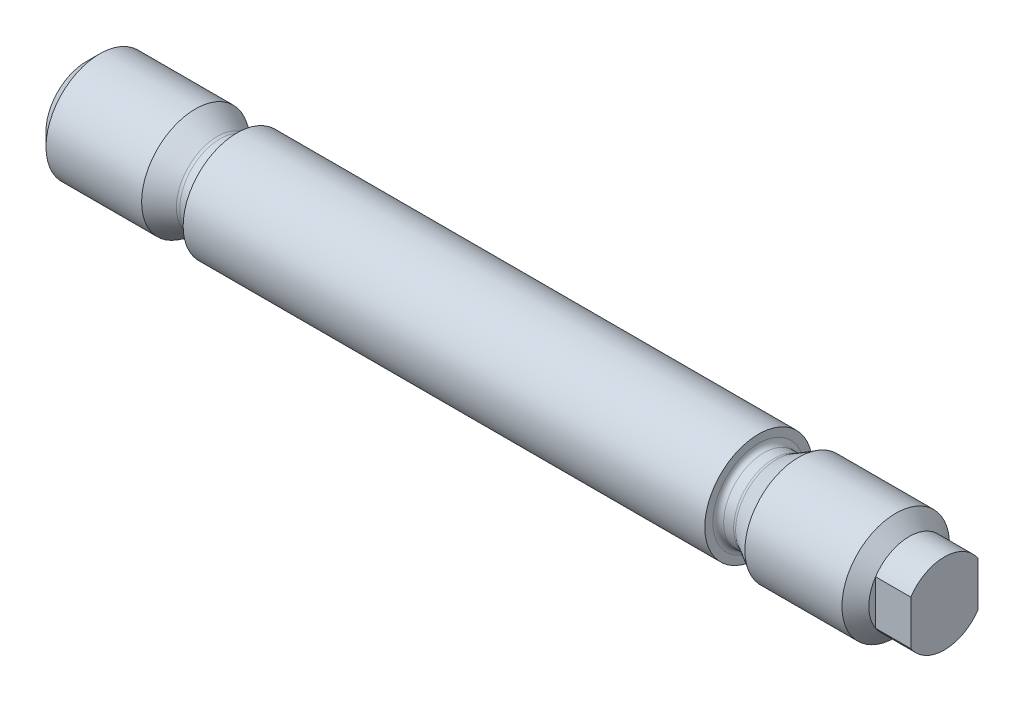
ISO-10303-21;
HEADER;
FILE_DESCRIPTION(('STEP AP214'),'2;1');
FILE_NAME('part.step','',(''),(''),'','','');
FILE_SCHEMA(('AUTOMOTIVE_DESIGN { 1 0 10303 214 1 1 1 1 }'));
ENDSEC;
DATA;
#1=APPLICATION_CONTEXT('core data for automotive mechanical design processes');
#2=APPLICATION_PROTOCOL_DEFINITION('international standard','automotive_design',2000,#1);
#3=PRODUCT_CONTEXT('',#1,'mechanical');
#4=PRODUCT('Part','Part','',(#3));
#5=PRODUCT_RELATED_PRODUCT_CATEGORY('part','',(#4));
#6=PRODUCT_DEFINITION_FORMATION('','',#4);
#7=PRODUCT_DEFINITION_CONTEXT('part definition',#1,'design');
#8=PRODUCT_DEFINITION('design','',#6,#7);
#9=PRODUCT_DEFINITION_SHAPE('','',#8);
#10=(LENGTH_UNIT() NAMED_UNIT(*) SI_UNIT(.MILLI.,.METRE.));
#11=(NAMED_UNIT(*) PLANE_ANGLE_UNIT() SI_UNIT($,.RADIAN.));
#12=(NAMED_UNIT(*) SI_UNIT($,.STERADIAN.) SOLID_ANGLE_UNIT());
#13=UNCERTAINTY_MEASURE_WITH_UNIT(LENGTH_MEASURE(1.E-05),#10,'distance_accuracy_value','');
#14=(GEOMETRIC_REPRESENTATION_CONTEXT(3) GLOBAL_UNCERTAINTY_ASSIGNED_CONTEXT((#13)) GLOBAL_UNIT_ASSIGNED_CONTEXT((#10,
#11,#12)) REPRESENTATION_CONTEXT('',''));
#15=CARTESIAN_POINT('',(0.,0.,0.));
#16=DIRECTION('',(0.,0.,1.));
#17=DIRECTION('',(1.,0.,0.));
#18=AXIS2_PLACEMENT_3D('',#15,#16,#17);
#19=CARTESIAN_POINT('',(122.4,6.,0.));
#20=DIRECTION('',(1.,0.,0.));
#21=DIRECTION('',(0.,0.,-1.));
#22=AXIS2_PLACEMENT_3D('',#19,#20,#21);
#23=PLANE('',#22);
#24=DIRECTION('',(0.,1.,0.));
#25=VECTOR('',#24,1.);
#26=CARTESIAN_POINT('',(122.4,3.3166247903554,-5.));
#27=LINE('',#26,#25);
#28=CARTESIAN_POINT('',(122.4,-3.3166247903554,-5.));
#29=VERTEX_POINT('',#28);
#30=CARTESIAN_POINT('',(122.4,3.3166247903554,-5.));
#31=VERTEX_POINT('',#30);
#32=EDGE_CURVE('E47',#29,#31,#27,.T.);
#33=ORIENTED_EDGE('',*,*,#32,.F.);
#34=CARTESIAN_POINT('',(122.4,0.,0.));
#35=DIRECTION('',(-1.,0.,0.));
#36=DIRECTION('',(0.,0.,1.));
#37=AXIS2_PLACEMENT_3D('',#34,#35,#36);
#38=CIRCLE('',#37,6.);
#39=EDGE_CURVE('E40',#31,#29,#38,.T.);
#40=ORIENTED_EDGE('',*,*,#39,.F.);
#41=EDGE_LOOP('',(#33,#40));
#42=FACE_BOUND('',#41,.T.);
#43=ADVANCED_FACE('F32',(#42),#23,.T.);
#44=CARTESIAN_POINT('',(0.,6.,0.));
#45=DIRECTION('',(1.,0.,0.));
#46=DIRECTION('',(0.,0.,-1.));
#47=AXIS2_PLACEMENT_3D('',#44,#45,#46);
#48=PLANE('',#47);
#49=CARTESIAN_POINT('',(0.,0.,0.));
#50=DIRECTION('',(-1.,0.,0.));
#51=DIRECTION('',(0.,0.,1.));
#52=AXIS2_PLACEMENT_3D('',#49,#50,#51);
#53=CIRCLE('',#52,6.);
#54=CARTESIAN_POINT('',(0.,0.,6.));
#55=VERTEX_POINT('',#54);
#56=EDGE_CURVE('E93',#55,#55,#53,.T.);
#57=ORIENTED_EDGE('',*,*,#56,.T.);
#58=EDGE_LOOP('',(#57));
#59=FACE_BOUND('',#58,.T.);
#60=ADVANCED_FACE('F34',(#59),#48,.F.);
#61=DIRECTION('',(0.,-1.,0.));
#62=VECTOR('',#61,1.);
#63=CARTESIAN_POINT('',(122.4,3.3166247903554,5.));
#64=LINE('',#63,#62);
#65=CARTESIAN_POINT('',(122.4,3.3166247903554,5.));
#66=VERTEX_POINT('',#65);
#67=CARTESIAN_POINT('',(122.4,-3.3166247903554,5.));
#68=VERTEX_POINT('',#67);
#69=EDGE_CURVE('E154',#66,#68,#64,.T.);
#70=ORIENTED_EDGE('',*,*,#69,.F.);
#71=EDGE_CURVE('E41',#68,#66,#38,.T.);
#72=ORIENTED_EDGE('',*,*,#71,.F.);
#73=EDGE_LOOP('',(#70,#72));
#74=FACE_BOUND('',#73,.T.);
#75=ADVANCED_FACE('F165',(#74),#23,.T.);
#76=CARTESIAN_POINT('',(120.4,0.,0.));
#77=DIRECTION('',(-1.,0.,0.));
#78=DIRECTION('',(0.,0.,1.));
#79=AXIS2_PLACEMENT_3D('',#76,#77,#78);
#80=CONICAL_SURFACE('',#79,8.,0.785398163397448);
#81=EDGE_CURVE('E11',#66,#31,#38,.T.);
#82=ORIENTED_EDGE('',*,*,#81,.T.);
#83=ORIENTED_EDGE('',*,*,#39,.T.);
#84=CARTESIAN_POINT('',(122.4,0.,0.));
#85=DIRECTION('',(1.,0.,0.));
#86=DIRECTION('',(0.,0.,-1.));
#87=AXIS2_PLACEMENT_3D('',#84,#85,#86);
#88=CIRCLE('',#87,6.);
#89=EDGE_CURVE('E149',#68,#29,#88,.T.);
#90=ORIENTED_EDGE('',*,*,#89,.F.);
#91=ORIENTED_EDGE('',*,*,#71,.T.);
#92=EDGE_LOOP('',(#82,#83,#90,#91));
#93=FACE_BOUND('',#92,.T.);
#94=CARTESIAN_POINT('',(120.4,0.,0.));
#95=DIRECTION('',(-1.,0.,0.));
#96=DIRECTION('',(0.,0.,1.));
#97=AXIS2_PLACEMENT_3D('',#94,#95,#96);
#98=CIRCLE('',#97,8.);
#99=CARTESIAN_POINT('',(120.4,0.,8.));
#100=VERTEX_POINT('',#99);
#101=EDGE_CURVE('E139',#100,#100,#98,.T.);
#102=ORIENTED_EDGE('',*,*,#101,.F.);
#103=EDGE_LOOP('',(#102));
#104=FACE_BOUND('',#103,.T.);
#105=ADVANCED_FACE('F147',(#93,#104),#80,.T.);
#106=CARTESIAN_POINT('',(-3.175,0.,0.));
#107=DIRECTION('',(-1.,0.,0.));
#108=DIRECTION('',(0.,0.,1.));
#109=AXIS2_PLACEMENT_3D('',#106,#107,#108);
#110=CYLINDRICAL_SURFACE('',#109,8.);
#111=ORIENTED_EDGE('',*,*,#101,.T.);
#112=EDGE_LOOP('',(#111));
#113=FACE_BOUND('',#112,.T.);
#114=CARTESIAN_POINT('',(105.964101615138,0.,0.));
#115=DIRECTION('',(-1.,0.,0.));
#116=DIRECTION('',(0.,0.,1.));
#117=AXIS2_PLACEMENT_3D('',#114,#115,#116);
#118=CIRCLE('',#117,8.);
#119=CARTESIAN_POINT('',(105.964101615138,0.,8.));
#120=VERTEX_POINT('',#119);
#121=EDGE_CURVE('E137',#120,#120,#118,.T.);
#122=ORIENTED_EDGE('',*,*,#121,.F.);
#123=EDGE_LOOP('',(#122));
#124=FACE_BOUND('',#123,.T.);
#125=ADVANCED_FACE('F171',(#113,#124),#110,.T.);
#126=CARTESIAN_POINT('',(102.685640646055,0.,0.));
#127=DIRECTION('',(1.,0.,0.));
#128=DIRECTION('',(0.,0.,-1.));
#129=AXIS2_PLACEMENT_3D('',#126,#127,#128);
#130=CONICAL_SURFACE('',#129,6.10717967697245,0.523598775598296);
#131=ORIENTED_EDGE('',*,*,#121,.T.);
#132=EDGE_LOOP('',(#131));
#133=FACE_BOUND('',#132,.T.);
#134=CARTESIAN_POINT('',(102.685640646055,0.,0.));
#135=DIRECTION('',(-1.,0.,0.));
#136=DIRECTION('',(0.,0.,1.));
#137=AXIS2_PLACEMENT_3D('',#134,#135,#136);
#138=CIRCLE('',#137,6.10717967697245);
#139=CARTESIAN_POINT('',(102.685640646055,0.,6.10717967697245));
#140=VERTEX_POINT('',#139);
#141=EDGE_CURVE('E134',#140,#140,#138,.T.);
#142=ORIENTED_EDGE('',*,*,#141,.F.);
#143=EDGE_LOOP('',(#142));
#144=FACE_BOUND('',#143,.T.);
#145=ADVANCED_FACE('F192',(#133,#144),#130,.T.);
#146=CARTESIAN_POINT('',(102.285640646055,0.,0.));
#147=DIRECTION('',(-1.,0.,0.));
#148=DIRECTION('',(0.,0.,1.));
#149=AXIS2_PLACEMENT_3D('',#146,#147,#148);
#150=TOROIDAL_SURFACE('',#149,6.8,0.8);
#151=ORIENTED_EDGE('',*,*,#141,.T.);
#152=EDGE_LOOP('',(#151));
#153=FACE_BOUND('',#152,.T.);
#154=CARTESIAN_POINT('',(102.285640646055,0.,0.));
#155=DIRECTION('',(-1.,0.,0.));
#156=DIRECTION('',(0.,0.,1.));
#157=AXIS2_PLACEMENT_3D('',#154,#155,#156);
#158=CIRCLE('',#157,6.);
#159=CARTESIAN_POINT('',(102.285640646055,0.,6.));
#160=VERTEX_POINT('',#159);
#161=EDGE_CURVE('E131',#160,#160,#158,.T.);
#162=ORIENTED_EDGE('',*,*,#161,.F.);
#163=EDGE_LOOP('',(#162));
#164=FACE_BOUND('',#163,.T.);
#165=ADVANCED_FACE('F202',(#153,#164),#150,.F.);
#166=CARTESIAN_POINT('',(-3.175,0.,0.));
#167=DIRECTION('',(-1.,0.,0.));
#168=DIRECTION('',(0.,0.,1.));
#169=AXIS2_PLACEMENT_3D('',#166,#167,#168);
#170=CYLINDRICAL_SURFACE('',#169,6.);
#171=ORIENTED_EDGE('',*,*,#161,.T.);
#172=EDGE_LOOP('',(#171));
#173=FACE_BOUND('',#172,.T.);
#174=CARTESIAN_POINT('',(100.8,0.,0.));
#175=DIRECTION('',(-1.,0.,0.));
#176=DIRECTION('',(0.,0.,1.));
#177=AXIS2_PLACEMENT_3D('',#174,#175,#176);
#178=CIRCLE('',#177,6.);
#179=CARTESIAN_POINT('',(100.8,0.,6.));
#180=VERTEX_POINT('',#179);
#181=EDGE_CURVE('E128',#180,#180,#178,.T.);
#182=ORIENTED_EDGE('',*,*,#181,.F.);
#183=EDGE_LOOP('',(#182));
#184=FACE_BOUND('',#183,.T.);
#185=ADVANCED_FACE('F212',(#173,#184),#170,.T.);
#186=CARTESIAN_POINT('',(100.8,0.,0.));
#187=DIRECTION('',(-1.,0.,0.));
#188=DIRECTION('',(0.,0.,1.));
#189=AXIS2_PLACEMENT_3D('',#186,#187,#188);
#190=TOROIDAL_SURFACE('',#189,6.8,0.799999999999998);
#191=ORIENTED_EDGE('',*,*,#181,.T.);
#192=EDGE_LOOP('',(#191));
#193=FACE_BOUND('',#192,.T.);
#194=CARTESIAN_POINT('',(100.,0.,0.));
#195=DIRECTION('',(-1.,0.,0.));
#196=DIRECTION('',(0.,0.,1.));
#197=AXIS2_PLACEMENT_3D('',#194,#195,#196);
#198=CIRCLE('',#197,6.8);
#199=CARTESIAN_POINT('',(100.,0.,6.8));
#200=VERTEX_POINT('',#199);
#201=EDGE_CURVE('E125',#200,#200,#198,.T.);
#202=ORIENTED_EDGE('',*,*,#201,.F.);
#203=EDGE_LOOP('',(#202));
#204=FACE_BOUND('',#203,.T.);
#205=ADVANCED_FACE('F222',(#193,#204),#190,.F.);
#206=CARTESIAN_POINT('',(100.,8.,0.));
#207=DIRECTION('',(1.,0.,0.));
#208=DIRECTION('',(0.,0.,-1.));
#209=AXIS2_PLACEMENT_3D('',#206,#207,#208);
#210=PLANE('',#209);
#211=ORIENTED_EDGE('',*,*,#201,.T.);
#212=EDGE_LOOP('',(#211));
#213=FACE_BOUND('',#212,.T.);
#214=CARTESIAN_POINT('',(100.,0.,0.));
#215=DIRECTION('',(-1.,0.,0.));
#216=DIRECTION('',(0.,0.,1.));
#217=AXIS2_PLACEMENT_3D('',#214,#215,#216);
#218=CIRCLE('',#217,8.);
#219=CARTESIAN_POINT('',(100.,0.,8.));
#220=VERTEX_POINT('',#219);
#221=EDGE_CURVE('E122',#220,#220,#218,.T.);
#222=ORIENTED_EDGE('',*,*,#221,.F.);
#223=EDGE_LOOP('',(#222));
#224=FACE_BOUND('',#223,.T.);
#225=ADVANCED_FACE('F232',(#213,#224),#210,.T.);
#226=CARTESIAN_POINT('',(-3.175,0.,0.));
#227=DIRECTION('',(-1.,0.,0.));
#228=DIRECTION('',(0.,0.,1.));
#229=AXIS2_PLACEMENT_3D('',#226,#227,#228);
#230=CYLINDRICAL_SURFACE('',#229,8.);
#231=ORIENTED_EDGE('',*,*,#221,.T.);
#232=EDGE_LOOP('',(#231));
#233=FACE_BOUND('',#232,.T.);
#234=CARTESIAN_POINT('',(22.4,0.,0.));
#235=DIRECTION('',(-1.,0.,0.));
#236=DIRECTION('',(0.,0.,1.));
#237=AXIS2_PLACEMENT_3D('',#234,#235,#236);
#238=CIRCLE('',#237,8.);
#239=CARTESIAN_POINT('',(22.4,0.,8.));
#240=VERTEX_POINT('',#239);
#241=EDGE_CURVE('E119',#240,#240,#238,.T.);
#242=ORIENTED_EDGE('',*,*,#241,.F.);
#243=EDGE_LOOP('',(#242));
#244=FACE_BOUND('',#243,.T.);
#245=ADVANCED_FACE('F242',(#233,#244),#230,.T.);
#246=CARTESIAN_POINT('',(22.4,8.,0.));
#247=DIRECTION('',(1.,0.,0.));
#248=DIRECTION('',(0.,0.,-1.));
#249=AXIS2_PLACEMENT_3D('',#246,#247,#248);
#250=PLANE('',#249);
#251=CARTESIAN_POINT('',(22.4,0.,0.));
#252=DIRECTION('',(-1.,0.,0.));
#253=DIRECTION('',(0.,0.,1.));
#254=AXIS2_PLACEMENT_3D('',#251,#252,#253);
#255=CIRCLE('',#254,6.8);
#256=CARTESIAN_POINT('',(22.4,0.,6.8));
#257=VERTEX_POINT('',#256);
#258=EDGE_CURVE('E116',#257,#257,#255,.T.);
#259=ORIENTED_EDGE('',*,*,#258,.F.);
#260=EDGE_LOOP('',(#259));
#261=FACE_BOUND('',#260,.T.);
#262=ORIENTED_EDGE('',*,*,#241,.T.);
#263=EDGE_LOOP('',(#262));
#264=FACE_BOUND('',#263,.T.);
#265=ADVANCED_FACE('F252',(#261,#264),#250,.F.);
#266=CARTESIAN_POINT('',(21.6,0.,0.));
#267=DIRECTION('',(-1.,0.,0.));
#268=DIRECTION('',(0.,0.,1.));
#269=AXIS2_PLACEMENT_3D('',#266,#267,#268);
#270=TOROIDAL_SURFACE('',#269,6.8,0.799999999999999);
#271=CARTESIAN_POINT('',(21.6,0.,0.));
#272=DIRECTION('',(-1.,0.,0.));
#273=DIRECTION('',(0.,0.,1.));
#274=AXIS2_PLACEMENT_3D('',#271,#272,#273);
#275=CIRCLE('',#274,6.);
#276=CARTESIAN_POINT('',(21.6,0.,6.));
#277=VERTEX_POINT('',#276);
#278=EDGE_CURVE('E113',#277,#277,#275,.T.);
#279=ORIENTED_EDGE('',*,*,#278,.F.);
#280=EDGE_LOOP('',(#279));
#281=FACE_BOUND('',#280,.T.);
#282=ORIENTED_EDGE('',*,*,#258,.T.);
#283=EDGE_LOOP('',(#282));
#284=FACE_BOUND('',#283,.T.);
#285=ADVANCED_FACE('F262',(#281,#284),#270,.F.);
#286=CARTESIAN_POINT('',(-3.175,0.,0.));
#287=DIRECTION('',(-1.,0.,0.));
#288=DIRECTION('',(0.,0.,1.));
#289=AXIS2_PLACEMENT_3D('',#286,#287,#288);
#290=CYLINDRICAL_SURFACE('',#289,6.);
#291=CARTESIAN_POINT('',(19.9,0.,0.));
#292=DIRECTION('',(-1.,0.,0.));
#293=DIRECTION('',(0.,0.,1.));
#294=AXIS2_PLACEMENT_3D('',#291,#292,#293);
#295=CIRCLE('',#294,6.);
#296=CARTESIAN_POINT('',(19.9,0.,6.));
#297=VERTEX_POINT('',#296);
#298=EDGE_CURVE('E110',#297,#297,#295,.T.);
#299=ORIENTED_EDGE('',*,*,#298,.F.);
#300=EDGE_LOOP('',(#299));
#301=FACE_BOUND('',#300,.T.);
#302=ORIENTED_EDGE('',*,*,#278,.T.);
#303=EDGE_LOOP('',(#302));
#304=FACE_BOUND('',#303,.T.);
#305=ADVANCED_FACE('F272',(#301,#304),#290,.T.);
#306=CARTESIAN_POINT('',(19.9,0.,0.));
#307=DIRECTION('',(-1.,0.,0.));
#308=DIRECTION('',(0.,0.,1.));
#309=AXIS2_PLACEMENT_3D('',#306,#307,#308);
#310=TOROIDAL_SURFACE('',#309,6.8,0.8);
#311=CARTESIAN_POINT('',(19.5,0.,0.));
#312=DIRECTION('',(-1.,0.,0.));
#313=DIRECTION('',(0.,0.,1.));
#314=AXIS2_PLACEMENT_3D('',#311,#312,#313);
#315=CIRCLE('',#314,6.10717967697244);
#316=CARTESIAN_POINT('',(19.5,0.,6.10717967697244));
#317=VERTEX_POINT('',#316);
#318=EDGE_CURVE('E107',#317,#317,#315,.T.);
#319=ORIENTED_EDGE('',*,*,#318,.F.);
#320=EDGE_LOOP('',(#319));
#321=FACE_BOUND('',#320,.T.);
#322=ORIENTED_EDGE('',*,*,#298,.T.);
#323=EDGE_LOOP('',(#322));
#324=FACE_BOUND('',#323,.T.);
#325=ADVANCED_FACE('F282',(#321,#324),#310,.F.);
#326=CARTESIAN_POINT('',(19.5,0.,0.));
#327=DIRECTION('',(-1.,0.,0.));
#328=DIRECTION('',(0.,0.,1.));
#329=AXIS2_PLACEMENT_3D('',#326,#327,#328);
#330=CONICAL_SURFACE('',#329,6.10717967697244,0.523598775598297);
#331=CARTESIAN_POINT('',(16.2215390309173,0.,0.));
#332=DIRECTION('',(-1.,0.,0.));
#333=DIRECTION('',(0.,0.,1.));
#334=AXIS2_PLACEMENT_3D('',#331,#332,#333);
#335=CIRCLE('',#334,8.);
#336=CARTESIAN_POINT('',(16.2215390309173,0.,8.));
#337=VERTEX_POINT('',#336);
#338=EDGE_CURVE('E104',#337,#337,#335,.T.);
#339=ORIENTED_EDGE('',*,*,#338,.F.);
#340=EDGE_LOOP('',(#339));
#341=FACE_BOUND('',#340,.T.);
#342=ORIENTED_EDGE('',*,*,#318,.T.);
#343=EDGE_LOOP('',(#342));
#344=FACE_BOUND('',#343,.T.);
#345=ADVANCED_FACE('F292',(#341,#344),#330,.T.);
#346=CARTESIAN_POINT('',(-3.175,0.,0.));
#347=DIRECTION('',(-1.,0.,0.));
#348=DIRECTION('',(0.,0.,1.));
#349=AXIS2_PLACEMENT_3D('',#346,#347,#348);
#350=CYLINDRICAL_SURFACE('',#349,8.);
#351=CARTESIAN_POINT('',(1.99999999999999,0.,0.));
#352=DIRECTION('',(-1.,0.,0.));
#353=DIRECTION('',(0.,0.,1.));
#354=AXIS2_PLACEMENT_3D('',#351,#352,#353);
#355=CIRCLE('',#354,8.);
#356=CARTESIAN_POINT('',(1.99999999999999,0.,8.));
#357=VERTEX_POINT('',#356);
#358=EDGE_CURVE('E96',#357,#357,#355,.T.);
#359=ORIENTED_EDGE('',*,*,#358,.F.);
#360=EDGE_LOOP('',(#359));
#361=FACE_BOUND('',#360,.T.);
#362=ORIENTED_EDGE('',*,*,#338,.T.);
#363=EDGE_LOOP('',(#362));
#364=FACE_BOUND('',#363,.T.);
#365=ADVANCED_FACE('F302',(#361,#364),#350,.T.);
#366=CARTESIAN_POINT('',(1.99999999999999,0.,0.));
#367=DIRECTION('',(1.,0.,0.));
#368=DIRECTION('',(0.,0.,-1.));
#369=AXIS2_PLACEMENT_3D('',#366,#367,#368);
#370=CONICAL_SURFACE('',#369,8.,0.78539816339745);
#371=ORIENTED_EDGE('',*,*,#56,.F.);
#372=EDGE_LOOP('',(#371));
#373=FACE_BOUND('',#372,.T.);
#374=ORIENTED_EDGE('',*,*,#358,.T.);
#375=EDGE_LOOP('',(#374));
#376=FACE_BOUND('',#375,.T.);
#377=ADVANCED_FACE('F311',(#373,#376),#370,.T.);
#378=CARTESIAN_POINT('',(127.64,0.,0.));
#379=DIRECTION('',(-1.,0.,0.));
#380=DIRECTION('',(0.,0.,1.));
#381=AXIS2_PLACEMENT_3D('',#378,#379,#380);
#382=CYLINDRICAL_SURFACE('',#381,6.);
#383=ORIENTED_EDGE('',*,*,#81,.F.);
#384=DIRECTION('',(-1.,0.,0.));
#385=VECTOR('',#384,1.);
#386=CARTESIAN_POINT('',(127.64,3.3166247903554,5.));
#387=LINE('',#386,#385);
#388=CARTESIAN_POINT('',(127.64,3.3166247903554,5.));
#389=VERTEX_POINT('',#388);
#390=EDGE_CURVE('E75',#389,#66,#387,.T.);
#391=ORIENTED_EDGE('',*,*,#390,.F.);
#392=CARTESIAN_POINT('',(127.64,0.,0.));
#393=DIRECTION('',(1.,0.,0.));
#394=DIRECTION('',(0.,0.,-1.));
#395=AXIS2_PLACEMENT_3D('',#392,#393,#394);
#396=CIRCLE('',#395,6.);
#397=CARTESIAN_POINT('',(127.64,3.3166247903554,-5.));
#398=VERTEX_POINT('',#397);
#399=EDGE_CURVE('E82',#398,#389,#396,.T.);
#400=ORIENTED_EDGE('',*,*,#399,.F.);
#401=DIRECTION('',(-1.,0.,0.));
#402=VECTOR('',#401,1.);
#403=CARTESIAN_POINT('',(127.64,3.3166247903554,-5.));
#404=LINE('',#403,#402);
#405=EDGE_CURVE('E158',#398,#31,#404,.T.);
#406=ORIENTED_EDGE('',*,*,#405,.T.);
#407=EDGE_LOOP('',(#383,#391,#400,#406));
#408=FACE_BOUND('',#407,.T.);
#409=ADVANCED_FACE('F92',(#408),#382,.T.);
#410=CARTESIAN_POINT('',(127.64,3.3166247903554,5.));
#411=DIRECTION('',(0.,0.,-1.));
#412=DIRECTION('',(-1.,0.,0.));
#413=AXIS2_PLACEMENT_3D('',#410,#411,#412);
#414=PLANE('',#413);
#415=ORIENTED_EDGE('',*,*,#69,.T.);
#416=DIRECTION('',(-1.,0.,0.));
#417=VECTOR('',#416,1.);
#418=CARTESIAN_POINT('',(127.64,-3.3166247903554,5.));
#419=LINE('',#418,#417);
#420=CARTESIAN_POINT('',(127.64,-3.3166247903554,5.));
#421=VERTEX_POINT('',#420);
#422=EDGE_CURVE('E78',#421,#68,#419,.T.);
#423=ORIENTED_EDGE('',*,*,#422,.F.);
#424=DIRECTION('',(0.,-1.,0.));
#425=VECTOR('',#424,1.);
#426=CARTESIAN_POINT('',(127.64,3.3166247903554,5.));
#427=LINE('',#426,#425);
#428=EDGE_CURVE('E70',#389,#421,#427,.T.);
#429=ORIENTED_EDGE('',*,*,#428,.F.);
#430=ORIENTED_EDGE('',*,*,#390,.T.);
#431=EDGE_LOOP('',(#415,#423,#429,#430));
#432=FACE_BOUND('',#431,.T.);
#433=ADVANCED_FACE('F73',(#432),#414,.F.);
#434=CARTESIAN_POINT('',(127.64,0.,0.));
#435=DIRECTION('',(-1.,0.,0.));
#436=DIRECTION('',(0.,0.,1.));
#437=AXIS2_PLACEMENT_3D('',#434,#435,#436);
#438=CYLINDRICAL_SURFACE('',#437,6.);
#439=ORIENTED_EDGE('',*,*,#89,.T.);
#440=DIRECTION('',(-1.,0.,0.));
#441=VECTOR('',#440,1.);
#442=CARTESIAN_POINT('',(127.64,-3.3166247903554,-5.));
#443=LINE('',#442,#441);
#444=CARTESIAN_POINT('',(127.64,-3.3166247903554,-5.));
#445=VERTEX_POINT('',#444);
#446=EDGE_CURVE('E98',#445,#29,#443,.T.);
#447=ORIENTED_EDGE('',*,*,#446,.F.);
#448=CARTESIAN_POINT('',(127.64,0.,0.));
#449=DIRECTION('',(1.,0.,0.));
#450=DIRECTION('',(0.,0.,-1.));
#451=AXIS2_PLACEMENT_3D('',#448,#449,#450);
#452=CIRCLE('',#451,6.);
#453=EDGE_CURVE('E81',#421,#445,#452,.T.);
#454=ORIENTED_EDGE('',*,*,#453,.F.);
#455=ORIENTED_EDGE('',*,*,#422,.T.);
#456=EDGE_LOOP('',(#439,#447,#454,#455));
#457=FACE_BOUND('',#456,.T.);
#458=ADVANCED_FACE('F153',(#457),#438,.T.);
#459=CARTESIAN_POINT('',(127.64,3.3166247903554,-5.));
#460=DIRECTION('',(0.,0.,1.));
#461=DIRECTION('',(0.,-1.,0.));
#462=AXIS2_PLACEMENT_3D('',#459,#460,#461);
#463=PLANE('',#462);
#464=ORIENTED_EDGE('',*,*,#32,.T.);
#465=ORIENTED_EDGE('',*,*,#405,.F.);
#466=DIRECTION('',(0.,1.,0.));
#467=VECTOR('',#466,1.);
#468=CARTESIAN_POINT('',(127.64,3.3166247903554,-5.));
#469=LINE('',#468,#467);
#470=EDGE_CURVE('E87',#445,#398,#469,.T.);
#471=ORIENTED_EDGE('',*,*,#470,.F.);
#472=ORIENTED_EDGE('',*,*,#446,.T.);
#473=EDGE_LOOP('',(#464,#465,#471,#472));
#474=FACE_BOUND('',#473,.T.);
#475=ADVANCED_FACE('F157',(#474),#463,.F.);
#476=CARTESIAN_POINT('',(127.64,0.,0.));
#477=DIRECTION('',(1.,0.,0.));
#478=DIRECTION('',(0.,0.,-1.));
#479=AXIS2_PLACEMENT_3D('',#476,#477,#478);
#480=PLANE('',#479);
#481=ORIENTED_EDGE('',*,*,#399,.T.);
#482=ORIENTED_EDGE('',*,*,#428,.T.);
#483=ORIENTED_EDGE('',*,*,#453,.T.);
#484=ORIENTED_EDGE('',*,*,#470,.T.);
#485=EDGE_LOOP('',(#481,#482,#483,#484));
#486=FACE_BOUND('',#485,.T.);
#487=ADVANCED_FACE('F85',(#486),#480,.T.);
#488=CLOSED_SHELL('',(#43,#60,#75,#105,#125,#145,#165,#185,#205,#225,#245,#265,#285,#305,#325,
#345,#365,#377,#409,#433,#458,#475,#487));
#489=MANIFOLD_SOLID_BREP('B2',#488);
#490=ADVANCED_BREP_SHAPE_REPRESENTATION('',(#18,#489),#14);
#491=SHAPE_DEFINITION_REPRESENTATION(#9,#490);
ENDSEC;
END-ISO-10303-21;
